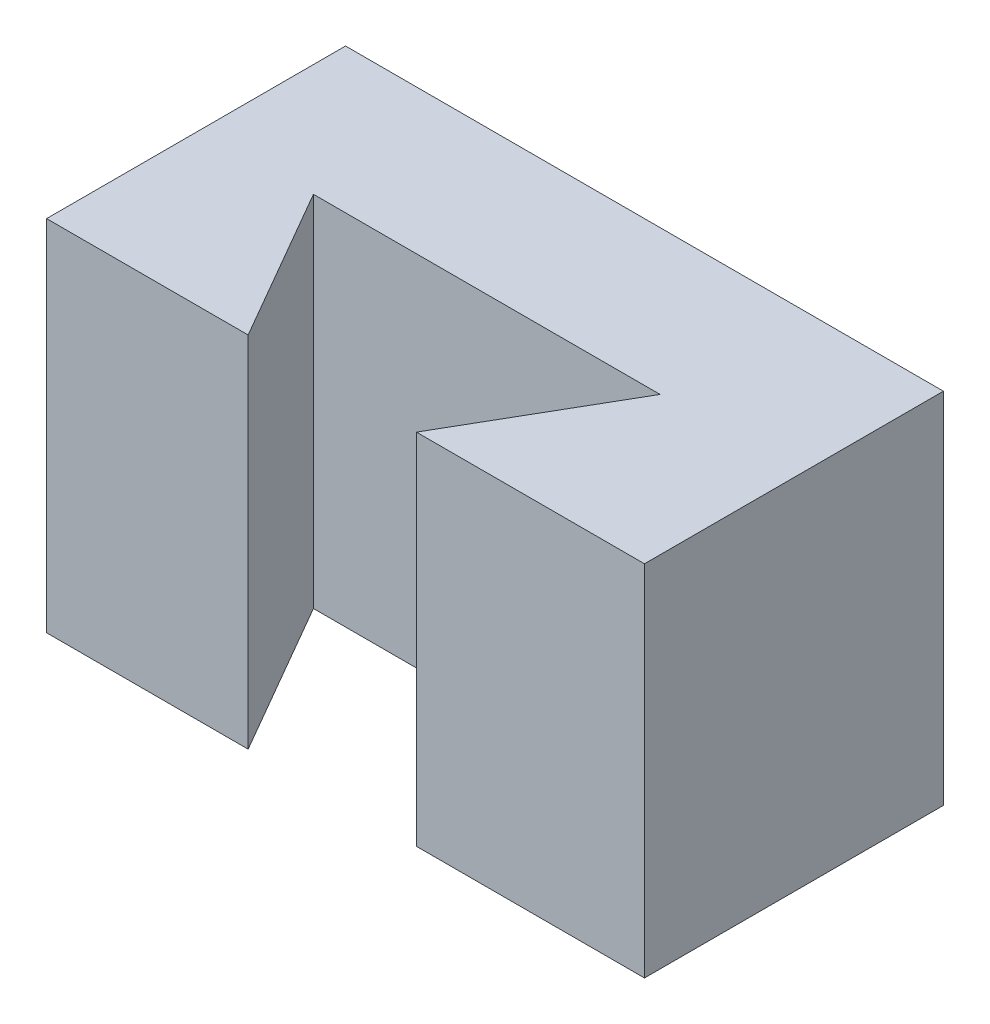
ISO-10303-21;
HEADER;
FILE_DESCRIPTION(('STEP AP214'),'2;1');
FILE_NAME('part.step','',(''),(''),'','','');
FILE_SCHEMA(('AUTOMOTIVE_DESIGN { 1 0 10303 214 1 1 1 1 }'));
ENDSEC;
DATA;
#1=APPLICATION_CONTEXT('core data for automotive mechanical design processes');
#2=APPLICATION_PROTOCOL_DEFINITION('international standard','automotive_design',2000,#1);
#3=PRODUCT_CONTEXT('',#1,'mechanical');
#4=PRODUCT('Part','Part','',(#3));
#5=PRODUCT_RELATED_PRODUCT_CATEGORY('part','',(#4));
#6=PRODUCT_DEFINITION_FORMATION('','',#4);
#7=PRODUCT_DEFINITION_CONTEXT('part definition',#1,'design');
#8=PRODUCT_DEFINITION('design','',#6,#7);
#9=PRODUCT_DEFINITION_SHAPE('','',#8);
#10=(LENGTH_UNIT() NAMED_UNIT(*) SI_UNIT(.MILLI.,.METRE.));
#11=(NAMED_UNIT(*) PLANE_ANGLE_UNIT() SI_UNIT($,.RADIAN.));
#12=(NAMED_UNIT(*) SI_UNIT($,.STERADIAN.) SOLID_ANGLE_UNIT());
#13=UNCERTAINTY_MEASURE_WITH_UNIT(LENGTH_MEASURE(1.E-05),#10,'distance_accuracy_value','');
#14=(GEOMETRIC_REPRESENTATION_CONTEXT(3) GLOBAL_UNCERTAINTY_ASSIGNED_CONTEXT((#13)) GLOBAL_UNIT_ASSIGNED_CONTEXT((#10,
#11,#12)) REPRESENTATION_CONTEXT('',''));
#15=CARTESIAN_POINT('',(0.,0.,0.));
#16=DIRECTION('',(0.,0.,1.));
#17=DIRECTION('',(1.,0.,0.));
#18=AXIS2_PLACEMENT_3D('',#15,#16,#17);
#19=CARTESIAN_POINT('',(-8.1439266494471,-0.00999999999999959,0.));
#20=DIRECTION('',(-0.866025403784436,0.,0.500000000000004));
#21=DIRECTION('',(0.500000000000004,0.,0.866025403784436));
#22=AXIS2_PLACEMENT_3D('',#19,#20,#21);
#23=PLANE('',#22);
#24=DIRECTION('',(0.,1.,0.));
#25=VECTOR('',#24,1.);
#26=CARTESIAN_POINT('',(-15.6020026458164,-0.00999999999999959,-12.9177665524214));
#27=LINE('',#26,#25);
#28=CARTESIAN_POINT('',(-15.6020026458164,0.,-12.9177665524214));
#29=VERTEX_POINT('',#28);
#30=CARTESIAN_POINT('',(-15.6020026458164,30.,-12.9177665524214));
#31=VERTEX_POINT('',#30);
#32=EDGE_CURVE('E11',#29,#31,#27,.T.);
#33=ORIENTED_EDGE('',*,*,#32,.T.);
#34=DIRECTION('',(0.500000000000004,0.,0.866025403784436));
#35=VECTOR('',#34,1.);
#36=CARTESIAN_POINT('',(-6.10794498708529,30.,3.52642368248916));
#37=LINE('',#36,#35);
#38=CARTESIAN_POINT('',(-8.1439266494471,30.,0.));
#39=VERTEX_POINT('',#38);
#40=EDGE_CURVE('E149',#31,#39,#37,.T.);
#41=ORIENTED_EDGE('',*,*,#40,.T.);
#42=DIRECTION('',(0.,1.,0.));
#43=VECTOR('',#42,1.);
#44=CARTESIAN_POINT('',(-8.1439266494471,-0.00999999999999959,0.));
#45=LINE('',#44,#43);
#46=CARTESIAN_POINT('',(-8.1439266494471,0.,0.));
#47=VERTEX_POINT('',#46);
#48=EDGE_CURVE('E47',#47,#39,#45,.T.);
#49=ORIENTED_EDGE('',*,*,#48,.F.);
#50=DIRECTION('',(0.500000000000004,0.,0.866025403784436));
#51=VECTOR('',#50,1.);
#52=CARTESIAN_POINT('',(-6.10794498708529,0.,3.52642368248916));
#53=LINE('',#52,#51);
#54=EDGE_CURVE('E57',#29,#47,#53,.T.);
#55=ORIENTED_EDGE('',*,*,#54,.F.);
#56=EDGE_LOOP('',(#33,#41,#49,#55));
#57=FACE_BOUND('',#56,.T.);
#58=ADVANCED_FACE('F43',(#57),#23,.F.);
#59=CARTESIAN_POINT('',(-15.6020026458164,-0.00999999999999959,-12.9177665524214));
#60=DIRECTION('',(0.,0.,-1.));
#61=DIRECTION('',(-1.,0.,0.));
#62=AXIS2_PLACEMENT_3D('',#59,#60,#61);
#63=PLANE('',#62);
#64=DIRECTION('',(0.,1.,0.));
#65=VECTOR('',#64,1.);
#66=CARTESIAN_POINT('',(13.3868545971668,-0.00999999999999959,-12.9177665524214));
#67=LINE('',#66,#65);
#68=CARTESIAN_POINT('',(13.3868545971668,0.,-12.9177665524214));
#69=VERTEX_POINT('',#68);
#70=CARTESIAN_POINT('',(13.3868545971668,30.,-12.9177665524214));
#71=VERTEX_POINT('',#70);
#72=EDGE_CURVE('E167',#69,#71,#67,.T.);
#73=ORIENTED_EDGE('',*,*,#72,.T.);
#74=DIRECTION('',(-1.,0.,0.));
#75=VECTOR('',#74,1.);
#76=CARTESIAN_POINT('',(0.,30.,-12.9177665524214));
#77=LINE('',#76,#75);
#78=EDGE_CURVE('E152',#71,#31,#77,.T.);
#79=ORIENTED_EDGE('',*,*,#78,.T.);
#80=ORIENTED_EDGE('',*,*,#32,.F.);
#81=DIRECTION('',(-1.,0.,0.));
#82=VECTOR('',#81,1.);
#83=CARTESIAN_POINT('',(0.,0.,-12.9177665524214));
#84=LINE('',#83,#82);
#85=EDGE_CURVE('E134',#69,#29,#84,.T.);
#86=ORIENTED_EDGE('',*,*,#85,.F.);
#87=EDGE_LOOP('',(#73,#79,#80,#86));
#88=FACE_BOUND('',#87,.T.);
#89=ADVANCED_FACE('F189',(#88),#63,.F.);
#90=CARTESIAN_POINT('',(-8.1439266494471,-0.00999999999999959,0.));
#91=DIRECTION('',(0.,0.,-1.));
#92=DIRECTION('',(-1.,0.,0.));
#93=AXIS2_PLACEMENT_3D('',#90,#91,#92);
#94=PLANE('',#93);
#95=ORIENTED_EDGE('',*,*,#48,.T.);
#96=DIRECTION('',(-1.,0.,0.));
#97=VECTOR('',#96,1.);
#98=CARTESIAN_POINT('',(0.,30.,0.));
#99=LINE('',#98,#97);
#100=CARTESIAN_POINT('',(-25.,30.,0.));
#101=VERTEX_POINT('',#100);
#102=EDGE_CURVE('E159',#39,#101,#99,.T.);
#103=ORIENTED_EDGE('',*,*,#102,.T.);
#104=DIRECTION('',(0.,1.,0.));
#105=VECTOR('',#104,1.);
#106=CARTESIAN_POINT('',(-25.,-0.00999999999999959,0.));
#107=LINE('',#106,#105);
#108=CARTESIAN_POINT('',(-25.,0.,0.));
#109=VERTEX_POINT('',#108);
#110=EDGE_CURVE('E148',#109,#101,#107,.T.);
#111=ORIENTED_EDGE('',*,*,#110,.F.);
#112=DIRECTION('',(-1.,0.,0.));
#113=VECTOR('',#112,1.);
#114=CARTESIAN_POINT('',(0.,0.,0.));
#115=LINE('',#114,#113);
#116=EDGE_CURVE('E146',#47,#109,#115,.T.);
#117=ORIENTED_EDGE('',*,*,#116,.F.);
#118=EDGE_LOOP('',(#95,#103,#111,#117));
#119=FACE_BOUND('',#118,.T.);
#120=ADVANCED_FACE('F45',(#119),#94,.F.);
#121=CARTESIAN_POINT('',(13.3868545971668,-0.00999999999999959,-12.9177665524214));
#122=DIRECTION('',(0.866025403784436,0.,0.500000000000004));
#123=DIRECTION('',(0.500000000000004,0.,-0.866025403784436));
#124=AXIS2_PLACEMENT_3D('',#121,#122,#123);
#125=PLANE('',#124);
#126=DIRECTION('',(0.,1.,0.));
#127=VECTOR('',#126,1.);
#128=CARTESIAN_POINT('',(5.92877860079748,-0.00999999999999959,0.));
#129=LINE('',#128,#127);
#130=CARTESIAN_POINT('',(5.92877860079748,0.,0.));
#131=VERTEX_POINT('',#130);
#132=CARTESIAN_POINT('',(5.92877860079748,30.,0.));
#133=VERTEX_POINT('',#132);
#134=EDGE_CURVE('E151',#131,#133,#129,.T.);
#135=ORIENTED_EDGE('',*,*,#134,.T.);
#136=DIRECTION('',(0.500000000000004,0.,-0.866025403784436));
#137=VECTOR('',#136,1.);
#138=CARTESIAN_POINT('',(4.44658395059808,30.,2.5672364408521));
#139=LINE('',#138,#137);
#140=EDGE_CURVE('E155',#133,#71,#139,.T.);
#141=ORIENTED_EDGE('',*,*,#140,.T.);
#142=ORIENTED_EDGE('',*,*,#72,.F.);
#143=DIRECTION('',(0.500000000000004,0.,-0.866025403784436));
#144=VECTOR('',#143,1.);
#145=CARTESIAN_POINT('',(4.44658395059808,0.,2.5672364408521));
#146=LINE('',#145,#144);
#147=EDGE_CURVE('E140',#131,#69,#146,.T.);
#148=ORIENTED_EDGE('',*,*,#147,.F.);
#149=EDGE_LOOP('',(#135,#141,#142,#148));
#150=FACE_BOUND('',#149,.T.);
#151=ADVANCED_FACE('F188',(#150),#125,.F.);
#152=CARTESIAN_POINT('',(5.92877860079748,-0.00999999999999959,0.));
#153=DIRECTION('',(0.,0.,-1.));
#154=DIRECTION('',(-1.,0.,0.));
#155=AXIS2_PLACEMENT_3D('',#152,#153,#154);
#156=PLANE('',#155);
#157=DIRECTION('',(0.,-1.,0.));
#158=VECTOR('',#157,1.);
#159=CARTESIAN_POINT('',(25.,30.,0.));
#160=LINE('',#159,#158);
#161=CARTESIAN_POINT('',(25.,30.,0.));
#162=VERTEX_POINT('',#161);
#163=CARTESIAN_POINT('',(25.,0.,0.));
#164=VERTEX_POINT('',#163);
#165=EDGE_CURVE('E162',#162,#164,#160,.T.);
#166=ORIENTED_EDGE('',*,*,#165,.F.);
#167=DIRECTION('',(-1.,0.,0.));
#168=VECTOR('',#167,1.);
#169=CARTESIAN_POINT('',(0.,30.,0.));
#170=LINE('',#169,#168);
#171=EDGE_CURVE('E113',#162,#133,#170,.T.);
#172=ORIENTED_EDGE('',*,*,#171,.T.);
#173=ORIENTED_EDGE('',*,*,#134,.F.);
#174=DIRECTION('',(-1.,0.,0.));
#175=VECTOR('',#174,1.);
#176=CARTESIAN_POINT('',(0.,0.,0.));
#177=LINE('',#176,#175);
#178=EDGE_CURVE('E143',#164,#131,#177,.T.);
#179=ORIENTED_EDGE('',*,*,#178,.F.);
#180=EDGE_LOOP('',(#166,#172,#173,#179));
#181=FACE_BOUND('',#180,.T.);
#182=ADVANCED_FACE('F186',(#181),#156,.F.);
#183=CARTESIAN_POINT('',(25.,30.,-25.));
#184=DIRECTION('',(-1.,0.,0.));
#185=DIRECTION('',(0.,0.,1.));
#186=AXIS2_PLACEMENT_3D('',#183,#184,#185);
#187=PLANE('',#186);
#188=DIRECTION('',(0.,0.,-1.));
#189=VECTOR('',#188,1.);
#190=CARTESIAN_POINT('',(25.,30.,-25.));
#191=LINE('',#190,#189);
#192=CARTESIAN_POINT('',(25.,30.,-25.));
#193=VERTEX_POINT('',#192);
#194=EDGE_CURVE('E105',#162,#193,#191,.T.);
#195=ORIENTED_EDGE('',*,*,#194,.F.);
#196=ORIENTED_EDGE('',*,*,#165,.T.);
#197=DIRECTION('',(0.,0.,-1.));
#198=VECTOR('',#197,1.);
#199=CARTESIAN_POINT('',(25.,0.,-25.));
#200=LINE('',#199,#198);
#201=CARTESIAN_POINT('',(25.,0.,-25.));
#202=VERTEX_POINT('',#201);
#203=EDGE_CURVE('E131',#164,#202,#200,.T.);
#204=ORIENTED_EDGE('',*,*,#203,.T.);
#205=DIRECTION('',(0.,-1.,0.));
#206=VECTOR('',#205,1.);
#207=CARTESIAN_POINT('',(25.,30.,-25.));
#208=LINE('',#207,#206);
#209=EDGE_CURVE('E123',#193,#202,#208,.T.);
#210=ORIENTED_EDGE('',*,*,#209,.F.);
#211=EDGE_LOOP('',(#195,#196,#204,#210));
#212=FACE_BOUND('',#211,.T.);
#213=ADVANCED_FACE('F129',(#212),#187,.F.);
#214=CARTESIAN_POINT('',(-25.,30.,-25.));
#215=DIRECTION('',(0.,0.,1.));
#216=DIRECTION('',(1.,0.,0.));
#217=AXIS2_PLACEMENT_3D('',#214,#215,#216);
#218=PLANE('',#217);
#219=DIRECTION('',(-1.,0.,0.));
#220=VECTOR('',#219,1.);
#221=CARTESIAN_POINT('',(-25.,0.,-25.));
#222=LINE('',#221,#220);
#223=CARTESIAN_POINT('',(-25.,0.,-25.));
#224=VERTEX_POINT('',#223);
#225=EDGE_CURVE('E179',#202,#224,#222,.T.);
#226=ORIENTED_EDGE('',*,*,#225,.T.);
#227=DIRECTION('',(0.,-1.,0.));
#228=VECTOR('',#227,1.);
#229=CARTESIAN_POINT('',(-25.,30.,-25.));
#230=LINE('',#229,#228);
#231=CARTESIAN_POINT('',(-25.,30.,-25.));
#232=VERTEX_POINT('',#231);
#233=EDGE_CURVE('E125',#232,#224,#230,.T.);
#234=ORIENTED_EDGE('',*,*,#233,.F.);
#235=DIRECTION('',(-1.,0.,0.));
#236=VECTOR('',#235,1.);
#237=CARTESIAN_POINT('',(-25.,30.,-25.));
#238=LINE('',#237,#236);
#239=EDGE_CURVE('E110',#193,#232,#238,.T.);
#240=ORIENTED_EDGE('',*,*,#239,.F.);
#241=ORIENTED_EDGE('',*,*,#209,.T.);
#242=EDGE_LOOP('',(#226,#234,#240,#241));
#243=FACE_BOUND('',#242,.T.);
#244=ADVANCED_FACE('F122',(#243),#218,.F.);
#245=CARTESIAN_POINT('',(-25.,30.,-25.));
#246=DIRECTION('',(1.,0.,0.));
#247=DIRECTION('',(0.,0.,-1.));
#248=AXIS2_PLACEMENT_3D('',#245,#246,#247);
#249=PLANE('',#248);
#250=DIRECTION('',(0.,0.,1.));
#251=VECTOR('',#250,1.);
#252=CARTESIAN_POINT('',(-25.,0.,-25.));
#253=LINE('',#252,#251);
#254=EDGE_CURVE('E118',#224,#109,#253,.T.);
#255=ORIENTED_EDGE('',*,*,#254,.T.);
#256=ORIENTED_EDGE('',*,*,#110,.T.);
#257=DIRECTION('',(0.,0.,1.));
#258=VECTOR('',#257,1.);
#259=CARTESIAN_POINT('',(-25.,30.,-25.));
#260=LINE('',#259,#258);
#261=EDGE_CURVE('E127',#232,#101,#260,.T.);
#262=ORIENTED_EDGE('',*,*,#261,.F.);
#263=ORIENTED_EDGE('',*,*,#233,.T.);
#264=EDGE_LOOP('',(#255,#256,#262,#263));
#265=FACE_BOUND('',#264,.T.);
#266=ADVANCED_FACE('F182',(#265),#249,.F.);
#267=CARTESIAN_POINT('',(0.,0.,0.));
#268=DIRECTION('',(0.,1.,0.));
#269=DIRECTION('',(0.,0.,1.));
#270=AXIS2_PLACEMENT_3D('',#267,#268,#269);
#271=PLANE('',#270);
#272=ORIENTED_EDGE('',*,*,#54,.T.);
#273=ORIENTED_EDGE('',*,*,#116,.T.);
#274=ORIENTED_EDGE('',*,*,#254,.F.);
#275=ORIENTED_EDGE('',*,*,#225,.F.);
#276=ORIENTED_EDGE('',*,*,#203,.F.);
#277=ORIENTED_EDGE('',*,*,#178,.T.);
#278=ORIENTED_EDGE('',*,*,#147,.T.);
#279=ORIENTED_EDGE('',*,*,#85,.T.);
#280=EDGE_LOOP('',(#272,#273,#274,#275,#276,#277,#278,#279));
#281=FACE_BOUND('',#280,.T.);
#282=ADVANCED_FACE('F183',(#281),#271,.F.);
#283=CARTESIAN_POINT('',(0.,30.,0.));
#284=DIRECTION('',(0.,1.,0.));
#285=DIRECTION('',(0.,0.,1.));
#286=AXIS2_PLACEMENT_3D('',#283,#284,#285);
#287=PLANE('',#286);
#288=ORIENTED_EDGE('',*,*,#102,.F.);
#289=ORIENTED_EDGE('',*,*,#40,.F.);
#290=ORIENTED_EDGE('',*,*,#78,.F.);
#291=ORIENTED_EDGE('',*,*,#140,.F.);
#292=ORIENTED_EDGE('',*,*,#171,.F.);
#293=ORIENTED_EDGE('',*,*,#194,.T.);
#294=ORIENTED_EDGE('',*,*,#239,.T.);
#295=ORIENTED_EDGE('',*,*,#261,.T.);
#296=EDGE_LOOP('',(#288,#289,#290,#291,#292,#293,#294,#295));
#297=FACE_BOUND('',#296,.T.);
#298=ADVANCED_FACE('F108',(#297),#287,.T.);
#299=CLOSED_SHELL('',(#58,#89,#120,#151,#182,#213,#244,#266,#282,#298));
#300=MANIFOLD_SOLID_BREP('B2',#299);
#301=ADVANCED_BREP_SHAPE_REPRESENTATION('',(#18,#300),#14);
#302=SHAPE_DEFINITION_REPRESENTATION(#9,#301);
ENDSEC;
END-ISO-10303-21;
